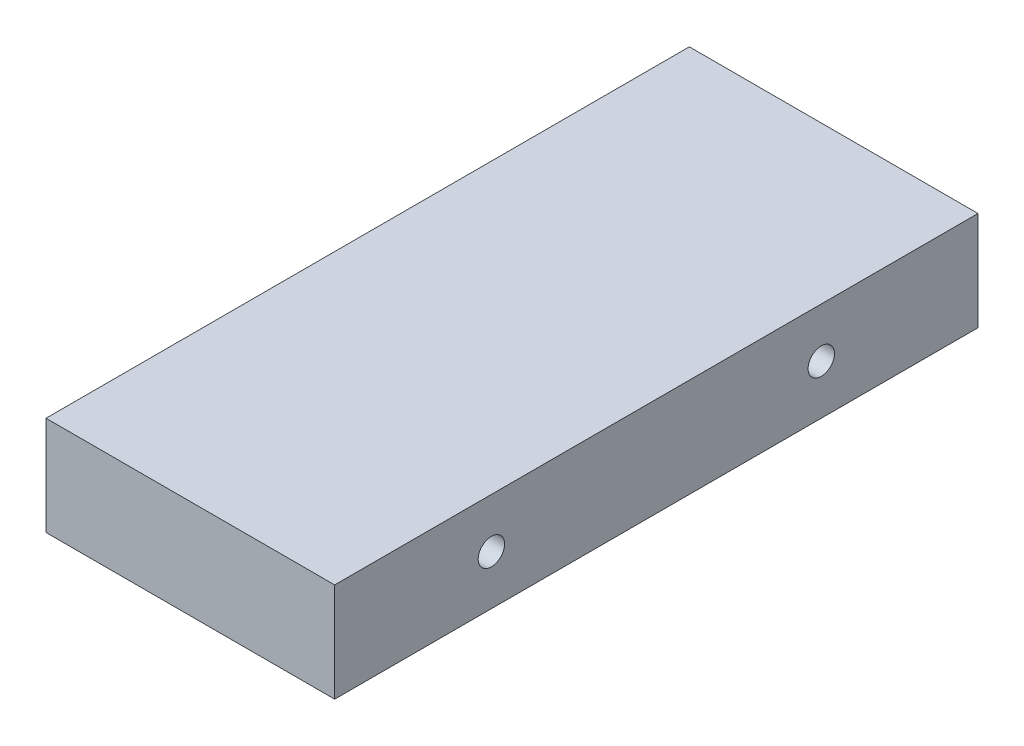
ISO-10303-21;
HEADER;
FILE_DESCRIPTION(('STEP AP214'),'2;1');
FILE_NAME('part.step','',(''),(''),'','','');
FILE_SCHEMA(('AUTOMOTIVE_DESIGN { 1 0 10303 214 1 1 1 1 }'));
ENDSEC;
DATA;
#1=APPLICATION_CONTEXT('core data for automotive mechanical design processes');
#2=APPLICATION_PROTOCOL_DEFINITION('international standard','automotive_design',2000,#1);
#3=PRODUCT_CONTEXT('',#1,'mechanical');
#4=PRODUCT('Part','Part','',(#3));
#5=PRODUCT_RELATED_PRODUCT_CATEGORY('part','',(#4));
#6=PRODUCT_DEFINITION_FORMATION('','',#4);
#7=PRODUCT_DEFINITION_CONTEXT('part definition',#1,'design');
#8=PRODUCT_DEFINITION('design','',#6,#7);
#9=PRODUCT_DEFINITION_SHAPE('','',#8);
#10=(LENGTH_UNIT() NAMED_UNIT(*) SI_UNIT(.MILLI.,.METRE.));
#11=(NAMED_UNIT(*) PLANE_ANGLE_UNIT() SI_UNIT($,.RADIAN.));
#12=(NAMED_UNIT(*) SI_UNIT($,.STERADIAN.) SOLID_ANGLE_UNIT());
#13=UNCERTAINTY_MEASURE_WITH_UNIT(LENGTH_MEASURE(1.E-05),#10,'distance_accuracy_value','');
#14=(GEOMETRIC_REPRESENTATION_CONTEXT(3) GLOBAL_UNCERTAINTY_ASSIGNED_CONTEXT((#13)) GLOBAL_UNIT_ASSIGNED_CONTEXT((#10,
#11,#12)) REPRESENTATION_CONTEXT('',''));
#15=CARTESIAN_POINT('',(0.,0.,0.));
#16=DIRECTION('',(0.,0.,1.));
#17=DIRECTION('',(1.,0.,0.));
#18=AXIS2_PLACEMENT_3D('',#15,#16,#17);
#19=CARTESIAN_POINT('',(35.,6.,39.));
#20=DIRECTION('',(0.,1.,0.));
#21=DIRECTION('',(0.,0.,1.));
#22=AXIS2_PLACEMENT_3D('',#19,#20,#21);
#23=PLANE('',#22);
#24=DIRECTION('',(0.,0.,-1.));
#25=VECTOR('',#24,1.);
#26=CARTESIAN_POINT('',(0.,6.,39.));
#27=LINE('',#26,#25);
#28=CARTESIAN_POINT('',(0.,6.,39.));
#29=VERTEX_POINT('',#28);
#30=CARTESIAN_POINT('',(0.,6.,-39.));
#31=VERTEX_POINT('',#30);
#32=EDGE_CURVE('E101',#29,#31,#27,.T.);
#33=ORIENTED_EDGE('',*,*,#32,.F.);
#34=DIRECTION('',(-1.,0.,0.));
#35=VECTOR('',#34,1.);
#36=CARTESIAN_POINT('',(35.,6.,39.));
#37=LINE('',#36,#35);
#38=CARTESIAN_POINT('',(35.,6.,39.));
#39=VERTEX_POINT('',#38);
#40=EDGE_CURVE('E11',#39,#29,#37,.T.);
#41=ORIENTED_EDGE('',*,*,#40,.F.);
#42=DIRECTION('',(0.,0.,-1.));
#43=VECTOR('',#42,1.);
#44=CARTESIAN_POINT('',(35.,6.,39.));
#45=LINE('',#44,#43);
#46=CARTESIAN_POINT('',(35.,6.,-39.));
#47=VERTEX_POINT('',#46);
#48=EDGE_CURVE('E95',#39,#47,#45,.T.);
#49=ORIENTED_EDGE('',*,*,#48,.T.);
#50=DIRECTION('',(-1.,0.,0.));
#51=VECTOR('',#50,1.);
#52=CARTESIAN_POINT('',(35.,6.,-39.));
#53=LINE('',#52,#51);
#54=EDGE_CURVE('E74',#47,#31,#53,.T.);
#55=ORIENTED_EDGE('',*,*,#54,.T.);
#56=EDGE_LOOP('',(#33,#41,#49,#55));
#57=FACE_BOUND('',#56,.T.);
#58=ADVANCED_FACE('F33',(#57),#23,.T.);
#59=CARTESIAN_POINT('',(35.,6.,39.));
#60=DIRECTION('',(0.,0.,-1.));
#61=DIRECTION('',(-1.,0.,0.));
#62=AXIS2_PLACEMENT_3D('',#59,#60,#61);
#63=PLANE('',#62);
#64=DIRECTION('',(0.,-1.,0.));
#65=VECTOR('',#64,1.);
#66=CARTESIAN_POINT('',(0.,6.,39.));
#67=LINE('',#66,#65);
#68=CARTESIAN_POINT('',(0.,-6.,39.));
#69=VERTEX_POINT('',#68);
#70=EDGE_CURVE('E66',#29,#69,#67,.T.);
#71=ORIENTED_EDGE('',*,*,#70,.T.);
#72=DIRECTION('',(-1.,0.,0.));
#73=VECTOR('',#72,1.);
#74=CARTESIAN_POINT('',(35.,-6.,39.));
#75=LINE('',#74,#73);
#76=CARTESIAN_POINT('',(35.,-6.,39.));
#77=VERTEX_POINT('',#76);
#78=EDGE_CURVE('E42',#77,#69,#75,.T.);
#79=ORIENTED_EDGE('',*,*,#78,.F.);
#80=DIRECTION('',(0.,-1.,0.));
#81=VECTOR('',#80,1.);
#82=CARTESIAN_POINT('',(35.,6.,39.));
#83=LINE('',#82,#81);
#84=EDGE_CURVE('E84',#39,#77,#83,.T.);
#85=ORIENTED_EDGE('',*,*,#84,.F.);
#86=ORIENTED_EDGE('',*,*,#40,.T.);
#87=EDGE_LOOP('',(#71,#79,#85,#86));
#88=FACE_BOUND('',#87,.T.);
#89=ADVANCED_FACE('F159',(#88),#63,.F.);
#90=CARTESIAN_POINT('',(35.,-6.,39.));
#91=DIRECTION('',(0.,1.,0.));
#92=DIRECTION('',(0.,0.,1.));
#93=AXIS2_PLACEMENT_3D('',#90,#91,#92);
#94=PLANE('',#93);
#95=DIRECTION('',(0.,0.,-1.));
#96=VECTOR('',#95,1.);
#97=CARTESIAN_POINT('',(0.,-6.,39.));
#98=LINE('',#97,#96);
#99=CARTESIAN_POINT('',(0.,-6.,-39.));
#100=VERTEX_POINT('',#99);
#101=EDGE_CURVE('E91',#69,#100,#98,.T.);
#102=ORIENTED_EDGE('',*,*,#101,.T.);
#103=DIRECTION('',(-1.,0.,0.));
#104=VECTOR('',#103,1.);
#105=CARTESIAN_POINT('',(35.,-6.,-39.));
#106=LINE('',#105,#104);
#107=CARTESIAN_POINT('',(35.,-6.,-39.));
#108=VERTEX_POINT('',#107);
#109=EDGE_CURVE('E88',#108,#100,#106,.T.);
#110=ORIENTED_EDGE('',*,*,#109,.F.);
#111=DIRECTION('',(0.,0.,-1.));
#112=VECTOR('',#111,1.);
#113=CARTESIAN_POINT('',(35.,-6.,39.));
#114=LINE('',#113,#112);
#115=EDGE_CURVE('E79',#77,#108,#114,.T.);
#116=ORIENTED_EDGE('',*,*,#115,.F.);
#117=ORIENTED_EDGE('',*,*,#78,.T.);
#118=EDGE_LOOP('',(#102,#110,#116,#117));
#119=FACE_BOUND('',#118,.T.);
#120=ADVANCED_FACE('F89',(#119),#94,.F.);
#121=CARTESIAN_POINT('',(35.,6.,-39.));
#122=DIRECTION('',(0.,0.,-1.));
#123=DIRECTION('',(-1.,0.,0.));
#124=AXIS2_PLACEMENT_3D('',#121,#122,#123);
#125=PLANE('',#124);
#126=DIRECTION('',(0.,-1.,0.));
#127=VECTOR('',#126,1.);
#128=CARTESIAN_POINT('',(0.,6.,-39.));
#129=LINE('',#128,#127);
#130=EDGE_CURVE('E104',#31,#100,#129,.T.);
#131=ORIENTED_EDGE('',*,*,#130,.F.);
#132=ORIENTED_EDGE('',*,*,#54,.F.);
#133=DIRECTION('',(0.,-1.,0.));
#134=VECTOR('',#133,1.);
#135=CARTESIAN_POINT('',(35.,6.,-39.));
#136=LINE('',#135,#134);
#137=EDGE_CURVE('E83',#47,#108,#136,.T.);
#138=ORIENTED_EDGE('',*,*,#137,.T.);
#139=ORIENTED_EDGE('',*,*,#109,.T.);
#140=EDGE_LOOP('',(#131,#132,#138,#139));
#141=FACE_BOUND('',#140,.T.);
#142=ADVANCED_FACE('F94',(#141),#125,.T.);
#143=CARTESIAN_POINT('',(35.,0.,0.));
#144=DIRECTION('',(-1.,0.,0.));
#145=DIRECTION('',(0.,0.,1.));
#146=AXIS2_PLACEMENT_3D('',#143,#144,#145);
#147=PLANE('',#146);
#148=CARTESIAN_POINT('',(35.,0.,-20.));
#149=DIRECTION('',(1.,0.,0.));
#150=DIRECTION('',(0.,0.,-1.));
#151=AXIS2_PLACEMENT_3D('',#148,#149,#150);
#152=CIRCLE('',#151,1.6);
#153=CARTESIAN_POINT('',(35.,0.,-21.6));
#154=VERTEX_POINT('',#153);
#155=EDGE_CURVE('E112',#154,#154,#152,.T.);
#156=ORIENTED_EDGE('',*,*,#155,.F.);
#157=EDGE_LOOP('',(#156));
#158=FACE_BOUND('',#157,.T.);
#159=CARTESIAN_POINT('',(35.,0.,20.));
#160=DIRECTION('',(1.,0.,0.));
#161=DIRECTION('',(0.,0.,-1.));
#162=AXIS2_PLACEMENT_3D('',#159,#160,#161);
#163=CIRCLE('',#162,1.6);
#164=CARTESIAN_POINT('',(35.,0.,18.4));
#165=VERTEX_POINT('',#164);
#166=EDGE_CURVE('E118',#165,#165,#163,.T.);
#167=ORIENTED_EDGE('',*,*,#166,.F.);
#168=EDGE_LOOP('',(#167));
#169=FACE_BOUND('',#168,.T.);
#170=ORIENTED_EDGE('',*,*,#48,.F.);
#171=ORIENTED_EDGE('',*,*,#84,.T.);
#172=ORIENTED_EDGE('',*,*,#115,.T.);
#173=ORIENTED_EDGE('',*,*,#137,.F.);
#174=EDGE_LOOP('',(#170,#171,#172,#173));
#175=FACE_BOUND('',#174,.T.);
#176=ADVANCED_FACE('F82',(#158,#169,#175),#147,.F.);
#177=CARTESIAN_POINT('',(0.,0.,0.));
#178=DIRECTION('',(-1.,0.,0.));
#179=DIRECTION('',(0.,0.,1.));
#180=AXIS2_PLACEMENT_3D('',#177,#178,#179);
#181=PLANE('',#180);
#182=CARTESIAN_POINT('',(0.,0.,-34.));
#183=DIRECTION('',(1.,0.,0.));
#184=DIRECTION('',(0.,0.,-1.));
#185=AXIS2_PLACEMENT_3D('',#182,#183,#184);
#186=CIRCLE('',#185,1.621);
#187=CARTESIAN_POINT('',(0.,0.,-35.621));
#188=VERTEX_POINT('',#187);
#189=EDGE_CURVE('E272',#188,#188,#186,.T.);
#190=ORIENTED_EDGE('',*,*,#189,.T.);
#191=EDGE_LOOP('',(#190));
#192=FACE_BOUND('',#191,.T.);
#193=CARTESIAN_POINT('',(0.,0.,34.));
#194=DIRECTION('',(1.,0.,0.));
#195=DIRECTION('',(0.,0.,-1.));
#196=AXIS2_PLACEMENT_3D('',#193,#194,#195);
#197=CIRCLE('',#196,1.621);
#198=CARTESIAN_POINT('',(0.,0.,32.379));
#199=VERTEX_POINT('',#198);
#200=EDGE_CURVE('E274',#199,#199,#197,.T.);
#201=ORIENTED_EDGE('',*,*,#200,.T.);
#202=EDGE_LOOP('',(#201));
#203=FACE_BOUND('',#202,.T.);
#204=CARTESIAN_POINT('',(0.,0.,20.));
#205=DIRECTION('',(1.,0.,0.));
#206=DIRECTION('',(0.,0.,-1.));
#207=AXIS2_PLACEMENT_3D('',#204,#205,#206);
#208=CIRCLE('',#207,4.);
#209=CARTESIAN_POINT('',(0.,0.,16.));
#210=VERTEX_POINT('',#209);
#211=EDGE_CURVE('E131',#210,#210,#208,.T.);
#212=ORIENTED_EDGE('',*,*,#211,.T.);
#213=EDGE_LOOP('',(#212));
#214=FACE_BOUND('',#213,.T.);
#215=CARTESIAN_POINT('',(0.,0.,-20.));
#216=DIRECTION('',(1.,0.,0.));
#217=DIRECTION('',(0.,0.,-1.));
#218=AXIS2_PLACEMENT_3D('',#215,#216,#217);
#219=CIRCLE('',#218,4.);
#220=CARTESIAN_POINT('',(0.,0.,-24.));
#221=VERTEX_POINT('',#220);
#222=EDGE_CURVE('E134',#221,#221,#219,.T.);
#223=ORIENTED_EDGE('',*,*,#222,.T.);
#224=EDGE_LOOP('',(#223));
#225=FACE_BOUND('',#224,.T.);
#226=ORIENTED_EDGE('',*,*,#32,.T.);
#227=ORIENTED_EDGE('',*,*,#130,.T.);
#228=ORIENTED_EDGE('',*,*,#101,.F.);
#229=ORIENTED_EDGE('',*,*,#70,.F.);
#230=EDGE_LOOP('',(#226,#227,#228,#229));
#231=FACE_BOUND('',#230,.T.);
#232=ADVANCED_FACE('F154',(#192,#203,#214,#225,#231),#181,.T.);
#233=CARTESIAN_POINT('',(27.,0.,-20.));
#234=DIRECTION('',(-1.,0.,0.));
#235=DIRECTION('',(0.,0.,1.));
#236=AXIS2_PLACEMENT_3D('',#233,#234,#235);
#237=CYLINDRICAL_SURFACE('',#236,4.);
#238=CARTESIAN_POINT('',(27.,0.,-20.));
#239=DIRECTION('',(1.,0.,0.));
#240=DIRECTION('',(0.,0.,-1.));
#241=AXIS2_PLACEMENT_3D('',#238,#239,#240);
#242=CIRCLE('',#241,4.);
#243=CARTESIAN_POINT('',(27.,0.,-24.));
#244=VERTEX_POINT('',#243);
#245=EDGE_CURVE('E116',#244,#244,#242,.T.);
#246=ORIENTED_EDGE('',*,*,#245,.T.);
#247=EDGE_LOOP('',(#246));
#248=FACE_BOUND('',#247,.T.);
#249=ORIENTED_EDGE('',*,*,#222,.F.);
#250=EDGE_LOOP('',(#249));
#251=FACE_BOUND('',#250,.T.);
#252=ADVANCED_FACE('F139',(#248,#251),#237,.F.);
#253=CARTESIAN_POINT('',(27.,0.,-20.));
#254=DIRECTION('',(1.,0.,0.));
#255=DIRECTION('',(0.,0.,-1.));
#256=AXIS2_PLACEMENT_3D('',#253,#254,#255);
#257=PLANE('',#256);
#258=CARTESIAN_POINT('',(27.,0.,-20.));
#259=DIRECTION('',(1.,0.,0.));
#260=DIRECTION('',(0.,0.,-1.));
#261=AXIS2_PLACEMENT_3D('',#258,#259,#260);
#262=CIRCLE('',#261,1.6);
#263=CARTESIAN_POINT('',(27.,0.,-21.6));
#264=VERTEX_POINT('',#263);
#265=EDGE_CURVE('E36',#264,#264,#262,.F.);
#266=ORIENTED_EDGE('',*,*,#265,.F.);
#267=EDGE_LOOP('',(#266));
#268=FACE_BOUND('',#267,.T.);
#269=ORIENTED_EDGE('',*,*,#245,.F.);
#270=EDGE_LOOP('',(#269));
#271=FACE_BOUND('',#270,.T.);
#272=ADVANCED_FACE('F142',(#268,#271),#257,.F.);
#273=CARTESIAN_POINT('',(27.,0.,20.));
#274=DIRECTION('',(-1.,0.,0.));
#275=DIRECTION('',(0.,0.,1.));
#276=AXIS2_PLACEMENT_3D('',#273,#274,#275);
#277=CYLINDRICAL_SURFACE('',#276,4.);
#278=CARTESIAN_POINT('',(27.,0.,20.));
#279=DIRECTION('',(1.,0.,0.));
#280=DIRECTION('',(0.,0.,-1.));
#281=AXIS2_PLACEMENT_3D('',#278,#279,#280);
#282=CIRCLE('',#281,4.);
#283=CARTESIAN_POINT('',(27.,0.,16.));
#284=VERTEX_POINT('',#283);
#285=EDGE_CURVE('E105',#284,#284,#282,.T.);
#286=ORIENTED_EDGE('',*,*,#285,.T.);
#287=EDGE_LOOP('',(#286));
#288=FACE_BOUND('',#287,.T.);
#289=ORIENTED_EDGE('',*,*,#211,.F.);
#290=EDGE_LOOP('',(#289));
#291=FACE_BOUND('',#290,.T.);
#292=ADVANCED_FACE('F144',(#288,#291),#277,.F.);
#293=CARTESIAN_POINT('',(27.,0.,20.));
#294=DIRECTION('',(1.,0.,0.));
#295=DIRECTION('',(0.,0.,-1.));
#296=AXIS2_PLACEMENT_3D('',#293,#294,#295);
#297=PLANE('',#296);
#298=CARTESIAN_POINT('',(27.,0.,20.));
#299=DIRECTION('',(1.,0.,0.));
#300=DIRECTION('',(0.,0.,-1.));
#301=AXIS2_PLACEMENT_3D('',#298,#299,#300);
#302=CIRCLE('',#301,1.6);
#303=CARTESIAN_POINT('',(27.,0.,18.4));
#304=VERTEX_POINT('',#303);
#305=EDGE_CURVE('E110',#304,#304,#302,.F.);
#306=ORIENTED_EDGE('',*,*,#305,.F.);
#307=EDGE_LOOP('',(#306));
#308=FACE_BOUND('',#307,.T.);
#309=ORIENTED_EDGE('',*,*,#285,.F.);
#310=EDGE_LOOP('',(#309));
#311=FACE_BOUND('',#310,.T.);
#312=ADVANCED_FACE('F151',(#308,#311),#297,.F.);
#313=CARTESIAN_POINT('',(35.,0.,20.));
#314=DIRECTION('',(-1.,0.,0.));
#315=DIRECTION('',(0.,0.,1.));
#316=AXIS2_PLACEMENT_3D('',#313,#314,#315);
#317=CYLINDRICAL_SURFACE('',#316,1.6);
#318=ORIENTED_EDGE('',*,*,#166,.T.);
#319=EDGE_LOOP('',(#318));
#320=FACE_BOUND('',#319,.T.);
#321=ORIENTED_EDGE('',*,*,#305,.T.);
#322=EDGE_LOOP('',(#321));
#323=FACE_BOUND('',#322,.T.);
#324=ADVANCED_FACE('F204',(#320,#323),#317,.F.);
#325=CARTESIAN_POINT('',(35.,0.,-20.));
#326=DIRECTION('',(-1.,0.,0.));
#327=DIRECTION('',(0.,0.,1.));
#328=AXIS2_PLACEMENT_3D('',#325,#326,#327);
#329=CYLINDRICAL_SURFACE('',#328,1.6);
#330=ORIENTED_EDGE('',*,*,#155,.T.);
#331=EDGE_LOOP('',(#330));
#332=FACE_BOUND('',#331,.T.);
#333=ORIENTED_EDGE('',*,*,#265,.T.);
#334=EDGE_LOOP('',(#333));
#335=FACE_BOUND('',#334,.T.);
#336=ADVANCED_FACE('F214',(#332,#335),#329,.F.);
#337=CARTESIAN_POINT('',(12.,0.,34.));
#338=DIRECTION('',(-1.,0.,0.));
#339=DIRECTION('',(0.,0.,1.));
#340=AXIS2_PLACEMENT_3D('',#337,#338,#339);
#341=CYLINDRICAL_SURFACE('',#340,1.621);
#342=CARTESIAN_POINT('',(12.,0.,34.));
#343=DIRECTION('',(1.,0.,0.));
#344=DIRECTION('',(0.,0.,-1.));
#345=AXIS2_PLACEMENT_3D('',#342,#343,#344);
#346=CIRCLE('',#345,1.621);
#347=CARTESIAN_POINT('',(12.,0.,32.379));
#348=VERTEX_POINT('',#347);
#349=EDGE_CURVE('E126',#348,#348,#346,.T.);
#350=ORIENTED_EDGE('',*,*,#349,.T.);
#351=EDGE_LOOP('',(#350));
#352=FACE_BOUND('',#351,.T.);
#353=ORIENTED_EDGE('',*,*,#200,.F.);
#354=EDGE_LOOP('',(#353));
#355=FACE_BOUND('',#354,.T.);
#356=ADVANCED_FACE('F223',(#352,#355),#341,.F.);
#357=CARTESIAN_POINT('',(12.,0.,34.));
#358=DIRECTION('',(1.,0.,0.));
#359=DIRECTION('',(0.,0.,-1.));
#360=AXIS2_PLACEMENT_3D('',#357,#358,#359);
#361=PLANE('',#360);
#362=ORIENTED_EDGE('',*,*,#349,.F.);
#363=EDGE_LOOP('',(#362));
#364=FACE_BOUND('',#363,.T.);
#365=ADVANCED_FACE('F236',(#364),#361,.F.);
#366=CARTESIAN_POINT('',(12.,0.,-34.));
#367=DIRECTION('',(-1.,0.,0.));
#368=DIRECTION('',(0.,0.,1.));
#369=AXIS2_PLACEMENT_3D('',#366,#367,#368);
#370=CYLINDRICAL_SURFACE('',#369,1.621);
#371=CARTESIAN_POINT('',(12.,0.,-34.));
#372=DIRECTION('',(1.,0.,0.));
#373=DIRECTION('',(0.,0.,-1.));
#374=AXIS2_PLACEMENT_3D('',#371,#372,#373);
#375=CIRCLE('',#374,1.621);
#376=CARTESIAN_POINT('',(12.,0.,-35.621));
#377=VERTEX_POINT('',#376);
#378=EDGE_CURVE('E123',#377,#377,#375,.T.);
#379=ORIENTED_EDGE('',*,*,#378,.T.);
#380=EDGE_LOOP('',(#379));
#381=FACE_BOUND('',#380,.T.);
#382=ORIENTED_EDGE('',*,*,#189,.F.);
#383=EDGE_LOOP('',(#382));
#384=FACE_BOUND('',#383,.T.);
#385=ADVANCED_FACE('F246',(#381,#384),#370,.F.);
#386=CARTESIAN_POINT('',(12.,0.,-34.));
#387=DIRECTION('',(1.,0.,0.));
#388=DIRECTION('',(0.,0.,-1.));
#389=AXIS2_PLACEMENT_3D('',#386,#387,#388);
#390=PLANE('',#389);
#391=ORIENTED_EDGE('',*,*,#378,.F.);
#392=EDGE_LOOP('',(#391));
#393=FACE_BOUND('',#392,.T.);
#394=ADVANCED_FACE('F256',(#393),#390,.F.);
#395=CLOSED_SHELL('',(#58,#89,#120,#142,#176,#232,#252,#272,#292,#312,#324,#336,#356,#365,#385,#394));
#396=MANIFOLD_SOLID_BREP('B2',#395);
#397=ADVANCED_BREP_SHAPE_REPRESENTATION('',(#18,#396),#14);
#398=SHAPE_DEFINITION_REPRESENTATION(#9,#397);
ENDSEC;
END-ISO-10303-21;
